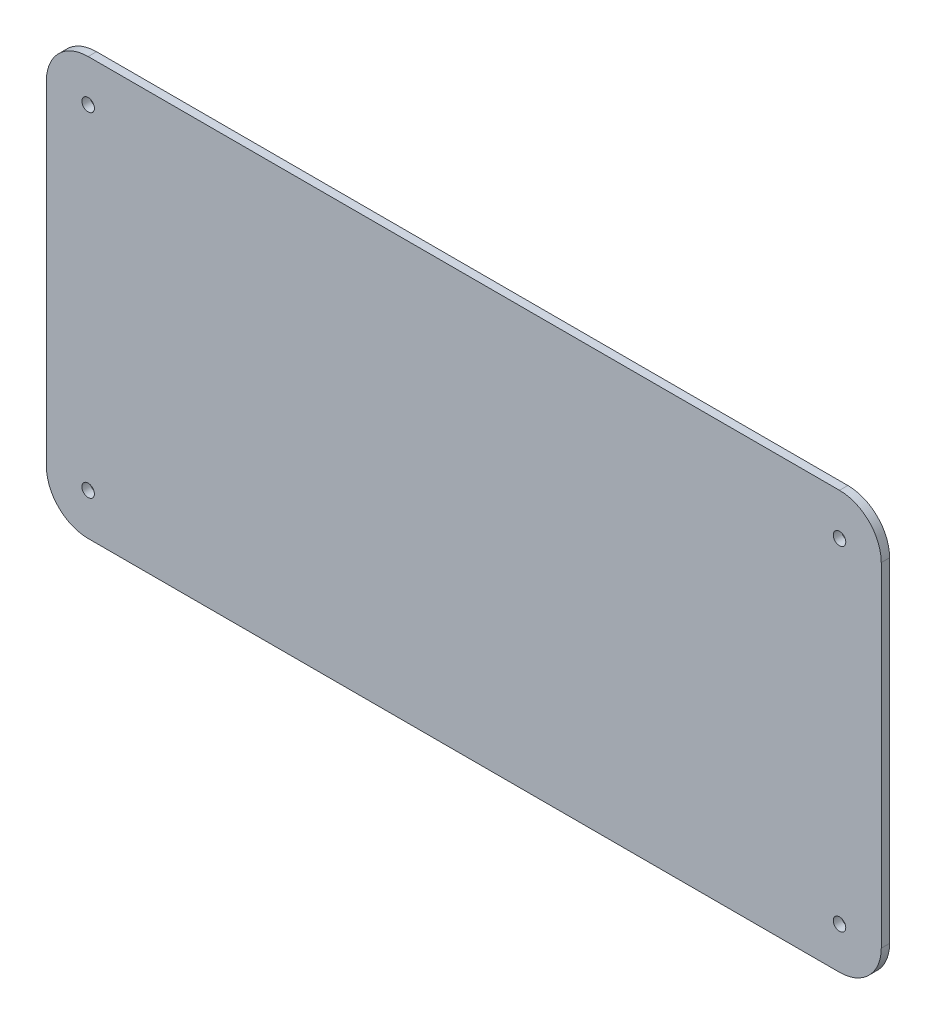
ISO-10303-21;
HEADER;
FILE_DESCRIPTION(('STEP AP214'),'2;1');
FILE_NAME('part.step','',(''),(''),'','','');
FILE_SCHEMA(('AUTOMOTIVE_DESIGN { 1 0 10303 214 1 1 1 1 }'));
ENDSEC;
DATA;
#1=APPLICATION_CONTEXT('core data for automotive mechanical design processes');
#2=APPLICATION_PROTOCOL_DEFINITION('international standard','automotive_design',2000,#1);
#3=PRODUCT_CONTEXT('',#1,'mechanical');
#4=PRODUCT('Part','Part','',(#3));
#5=PRODUCT_RELATED_PRODUCT_CATEGORY('part','',(#4));
#6=PRODUCT_DEFINITION_FORMATION('','',#4);
#7=PRODUCT_DEFINITION_CONTEXT('part definition',#1,'design');
#8=PRODUCT_DEFINITION('design','',#6,#7);
#9=PRODUCT_DEFINITION_SHAPE('','',#8);
#10=(LENGTH_UNIT() NAMED_UNIT(*) SI_UNIT(.MILLI.,.METRE.));
#11=(NAMED_UNIT(*) PLANE_ANGLE_UNIT() SI_UNIT($,.RADIAN.));
#12=(NAMED_UNIT(*) SI_UNIT($,.STERADIAN.) SOLID_ANGLE_UNIT());
#13=UNCERTAINTY_MEASURE_WITH_UNIT(LENGTH_MEASURE(1.E-05),#10,'distance_accuracy_value','');
#14=(GEOMETRIC_REPRESENTATION_CONTEXT(3) GLOBAL_UNCERTAINTY_ASSIGNED_CONTEXT((#13)) GLOBAL_UNIT_ASSIGNED_CONTEXT((#10,
#11,#12)) REPRESENTATION_CONTEXT('',''));
#15=CARTESIAN_POINT('',(0.,0.,0.));
#16=DIRECTION('',(0.,0.,1.));
#17=DIRECTION('',(1.,0.,0.));
#18=AXIS2_PLACEMENT_3D('',#15,#16,#17);
#19=CARTESIAN_POINT('',(81.474525227597,55.7590932445884,2.));
#20=DIRECTION('',(0.,0.,-1.));
#21=DIRECTION('',(-1.,0.,0.));
#22=AXIS2_PLACEMENT_3D('',#19,#20,#21);
#23=PLANE('',#22);
#24=CARTESIAN_POINT('',(81.474525227597,55.7590932445884,2.));
#25=DIRECTION('',(0.,0.,-1.));
#26=DIRECTION('',(-1.,0.,0.));
#27=AXIS2_PLACEMENT_3D('',#24,#25,#26);
#28=CIRCLE('',#27,9.99999999999999);
#29=CARTESIAN_POINT('',(81.474525227597,65.7590932445884,2.));
#30=VERTEX_POINT('',#29);
#31=CARTESIAN_POINT('',(91.474525227597,55.7590932445884,2.));
#32=VERTEX_POINT('',#31);
#33=EDGE_CURVE('E313',#30,#32,#28,.T.);
#34=ORIENTED_EDGE('',*,*,#33,.F.);
#35=DIRECTION('',(1.,0.,0.));
#36=VECTOR('',#35,1.);
#37=CARTESIAN_POINT('',(-98.5207026804079,65.7590932445884,2.));
#38=LINE('',#37,#36);
#39=CARTESIAN_POINT('',(-98.5207026804079,65.7590932445884,2.));
#40=VERTEX_POINT('',#39);
#41=EDGE_CURVE('E277',#40,#30,#38,.T.);
#42=ORIENTED_EDGE('',*,*,#41,.F.);
#43=CARTESIAN_POINT('',(-98.5207026804079,55.7590932445884,2.));
#44=DIRECTION('',(0.,0.,1.));
#45=DIRECTION('',(1.,0.,0.));
#46=AXIS2_PLACEMENT_3D('',#43,#44,#45);
#47=CIRCLE('',#46,9.99999999999999);
#48=CARTESIAN_POINT('',(-108.520702680408,55.7590932445884,2.));
#49=VERTEX_POINT('',#48);
#50=EDGE_CURVE('E272',#40,#49,#47,.T.);
#51=ORIENTED_EDGE('',*,*,#50,.T.);
#52=DIRECTION('',(0.,-1.,0.));
#53=VECTOR('',#52,1.);
#54=CARTESIAN_POINT('',(-108.520702680408,4.50909324458835,2.));
#55=LINE('',#54,#53);
#56=CARTESIAN_POINT('',(-108.520702680408,-24.2409067554117,2.));
#57=VERTEX_POINT('',#56);
#58=EDGE_CURVE('E262',#49,#57,#55,.T.);
#59=ORIENTED_EDGE('',*,*,#58,.T.);
#60=CARTESIAN_POINT('',(-98.5207026804079,-24.2409067554117,2.));
#61=DIRECTION('',(0.,0.,1.));
#62=DIRECTION('',(1.,0.,0.));
#63=AXIS2_PLACEMENT_3D('',#60,#61,#62);
#64=CIRCLE('',#63,10.);
#65=CARTESIAN_POINT('',(-98.5207026804079,-34.2409067554117,2.));
#66=VERTEX_POINT('',#65);
#67=EDGE_CURVE('E273',#57,#66,#64,.T.);
#68=ORIENTED_EDGE('',*,*,#67,.T.);
#69=DIRECTION('',(1.,0.,0.));
#70=VECTOR('',#69,1.);
#71=CARTESIAN_POINT('',(-98.5207026804079,-34.2409067554117,2.));
#72=LINE('',#71,#70);
#73=CARTESIAN_POINT('',(81.474525227597,-34.2409067554117,2.));
#74=VERTEX_POINT('',#73);
#75=EDGE_CURVE('E325',#66,#74,#72,.T.);
#76=ORIENTED_EDGE('',*,*,#75,.T.);
#77=CARTESIAN_POINT('',(81.474525227597,-24.2409067554117,2.));
#78=DIRECTION('',(0.,0.,1.));
#79=DIRECTION('',(1.,0.,0.));
#80=AXIS2_PLACEMENT_3D('',#77,#78,#79);
#81=CIRCLE('',#80,10.);
#82=CARTESIAN_POINT('',(91.474525227597,-24.2409067554117,2.));
#83=VERTEX_POINT('',#82);
#84=EDGE_CURVE('E317',#74,#83,#81,.T.);
#85=ORIENTED_EDGE('',*,*,#84,.T.);
#86=DIRECTION('',(0.,-1.,0.));
#87=VECTOR('',#86,1.);
#88=CARTESIAN_POINT('',(91.474525227597,55.7590932445884,2.));
#89=LINE('',#88,#87);
#90=EDGE_CURVE('E315',#32,#83,#89,.T.);
#91=ORIENTED_EDGE('',*,*,#90,.F.);
#92=EDGE_LOOP('',(#34,#42,#51,#59,#68,#76,#85,#91));
#93=FACE_BOUND('',#92,.T.);
#94=CARTESIAN_POINT('',(81.474525227597,55.7590932445884,2.));
#95=DIRECTION('',(0.,0.,1.));
#96=DIRECTION('',(1.,0.,0.));
#97=AXIS2_PLACEMENT_3D('',#94,#95,#96);
#98=CIRCLE('',#97,1.5);
#99=CARTESIAN_POINT('',(82.974525227597,55.7590932445884,2.));
#100=VERTEX_POINT('',#99);
#101=EDGE_CURVE('E299',#100,#100,#98,.T.);
#102=ORIENTED_EDGE('',*,*,#101,.F.);
#103=EDGE_LOOP('',(#102));
#104=FACE_BOUND('',#103,.T.);
#105=CARTESIAN_POINT('',(81.474525227597,-24.2409067554117,2.));
#106=DIRECTION('',(0.,0.,1.));
#107=DIRECTION('',(1.,0.,0.));
#108=AXIS2_PLACEMENT_3D('',#105,#106,#107);
#109=CIRCLE('',#108,1.5);
#110=CARTESIAN_POINT('',(82.974525227597,-24.2409067554117,2.));
#111=VERTEX_POINT('',#110);
#112=EDGE_CURVE('E441',#111,#111,#109,.T.);
#113=ORIENTED_EDGE('',*,*,#112,.F.);
#114=EDGE_LOOP('',(#113));
#115=FACE_BOUND('',#114,.T.);
#116=CARTESIAN_POINT('',(-98.5207026804079,-24.2409067554117,2.));
#117=DIRECTION('',(0.,0.,1.));
#118=DIRECTION('',(1.,0.,0.));
#119=AXIS2_PLACEMENT_3D('',#116,#117,#118);
#120=CIRCLE('',#119,1.5);
#121=CARTESIAN_POINT('',(-97.0207026804079,-24.2409067554117,2.));
#122=VERTEX_POINT('',#121);
#123=EDGE_CURVE('E435',#122,#122,#120,.T.);
#124=ORIENTED_EDGE('',*,*,#123,.F.);
#125=EDGE_LOOP('',(#124));
#126=FACE_BOUND('',#125,.T.);
#127=CARTESIAN_POINT('',(-98.5207026804079,55.7590932445884,2.));
#128=DIRECTION('',(0.,0.,1.));
#129=DIRECTION('',(1.,0.,0.));
#130=AXIS2_PLACEMENT_3D('',#127,#128,#129);
#131=CIRCLE('',#130,1.5);
#132=CARTESIAN_POINT('',(-97.0207026804079,55.7590932445884,2.));
#133=VERTEX_POINT('',#132);
#134=EDGE_CURVE('E426',#133,#133,#131,.T.);
#135=ORIENTED_EDGE('',*,*,#134,.F.);
#136=EDGE_LOOP('',(#135));
#137=FACE_BOUND('',#136,.T.);
#138=ADVANCED_FACE('F191',(#93,#104,#115,#126,#137),#23,.F.);
#139=CARTESIAN_POINT('',(81.474525227597,55.7590932445884,0.));
#140=DIRECTION('',(0.,0.,-1.));
#141=DIRECTION('',(-1.,0.,0.));
#142=AXIS2_PLACEMENT_3D('',#139,#140,#141);
#143=PLANE('',#142);
#144=CARTESIAN_POINT('',(-98.5207026804079,-24.2409067554117,0.));
#145=DIRECTION('',(0.,0.,1.));
#146=DIRECTION('',(1.,0.,0.));
#147=AXIS2_PLACEMENT_3D('',#144,#145,#146);
#148=CIRCLE('',#147,1.5);
#149=CARTESIAN_POINT('',(-97.0207026804079,-24.2409067554117,0.));
#150=VERTEX_POINT('',#149);
#151=EDGE_CURVE('E432',#150,#150,#148,.T.);
#152=ORIENTED_EDGE('',*,*,#151,.T.);
#153=EDGE_LOOP('',(#152));
#154=FACE_BOUND('',#153,.T.);
#155=CARTESIAN_POINT('',(81.474525227597,55.7590932445884,0.));
#156=DIRECTION('',(0.,0.,1.));
#157=DIRECTION('',(1.,0.,0.));
#158=AXIS2_PLACEMENT_3D('',#155,#156,#157);
#159=CIRCLE('',#158,1.5);
#160=CARTESIAN_POINT('',(82.974525227597,55.7590932445884,0.));
#161=VERTEX_POINT('',#160);
#162=EDGE_CURVE('E320',#161,#161,#159,.T.);
#163=ORIENTED_EDGE('',*,*,#162,.T.);
#164=EDGE_LOOP('',(#163));
#165=FACE_BOUND('',#164,.T.);
#166=CARTESIAN_POINT('',(81.474525227597,55.7590932445884,0.));
#167=DIRECTION('',(0.,0.,-1.));
#168=DIRECTION('',(-1.,0.,0.));
#169=AXIS2_PLACEMENT_3D('',#166,#167,#168);
#170=CIRCLE('',#169,9.99999999999999);
#171=CARTESIAN_POINT('',(81.474525227597,65.7590932445884,0.));
#172=VERTEX_POINT('',#171);
#173=CARTESIAN_POINT('',(91.474525227597,55.7590932445884,0.));
#174=VERTEX_POINT('',#173);
#175=EDGE_CURVE('E296',#172,#174,#170,.T.);
#176=ORIENTED_EDGE('',*,*,#175,.T.);
#177=DIRECTION('',(0.,-1.,0.));
#178=VECTOR('',#177,1.);
#179=CARTESIAN_POINT('',(91.474525227597,4.50909324458835,0.));
#180=LINE('',#179,#178);
#181=CARTESIAN_POINT('',(91.474525227597,-24.2409067554117,0.));
#182=VERTEX_POINT('',#181);
#183=EDGE_CURVE('E298',#174,#182,#180,.T.);
#184=ORIENTED_EDGE('',*,*,#183,.T.);
#185=CARTESIAN_POINT('',(81.474525227597,-24.2409067554117,0.));
#186=DIRECTION('',(0.,0.,1.));
#187=DIRECTION('',(1.,0.,0.));
#188=AXIS2_PLACEMENT_3D('',#185,#186,#187);
#189=CIRCLE('',#188,10.);
#190=CARTESIAN_POINT('',(81.474525227597,-34.2409067554117,0.));
#191=VERTEX_POINT('',#190);
#192=EDGE_CURVE('E302',#191,#182,#189,.T.);
#193=ORIENTED_EDGE('',*,*,#192,.F.);
#194=DIRECTION('',(1.,0.,0.));
#195=VECTOR('',#194,1.);
#196=CARTESIAN_POINT('',(-98.5207026804079,-34.2409067554117,0.));
#197=LINE('',#196,#195);
#198=CARTESIAN_POINT('',(-98.5207026804079,-34.2409067554117,0.));
#199=VERTEX_POINT('',#198);
#200=EDGE_CURVE('E304',#199,#191,#197,.T.);
#201=ORIENTED_EDGE('',*,*,#200,.F.);
#202=CARTESIAN_POINT('',(-98.5207026804079,-24.2409067554117,0.));
#203=DIRECTION('',(0.,0.,1.));
#204=DIRECTION('',(1.,0.,0.));
#205=AXIS2_PLACEMENT_3D('',#202,#203,#204);
#206=CIRCLE('',#205,10.);
#207=CARTESIAN_POINT('',(-108.520702680408,-24.2409067554117,0.));
#208=VERTEX_POINT('',#207);
#209=EDGE_CURVE('E306',#208,#199,#206,.T.);
#210=ORIENTED_EDGE('',*,*,#209,.F.);
#211=DIRECTION('',(0.,-1.,0.));
#212=VECTOR('',#211,1.);
#213=CARTESIAN_POINT('',(-108.520702680408,55.7590932445884,0.));
#214=LINE('',#213,#212);
#215=CARTESIAN_POINT('',(-108.520702680408,55.7590932445884,0.));
#216=VERTEX_POINT('',#215);
#217=EDGE_CURVE('E308',#216,#208,#214,.T.);
#218=ORIENTED_EDGE('',*,*,#217,.F.);
#219=CARTESIAN_POINT('',(-98.5207026804079,55.7590932445884,0.));
#220=DIRECTION('',(0.,0.,1.));
#221=DIRECTION('',(1.,0.,0.));
#222=AXIS2_PLACEMENT_3D('',#219,#220,#221);
#223=CIRCLE('',#222,9.99999999999999);
#224=CARTESIAN_POINT('',(-98.5207026804079,65.7590932445884,0.));
#225=VERTEX_POINT('',#224);
#226=EDGE_CURVE('E280',#225,#216,#223,.T.);
#227=ORIENTED_EDGE('',*,*,#226,.F.);
#228=DIRECTION('',(1.,0.,0.));
#229=VECTOR('',#228,1.);
#230=CARTESIAN_POINT('',(-98.5207026804079,65.7590932445884,0.));
#231=LINE('',#230,#229);
#232=EDGE_CURVE('E311',#225,#172,#231,.T.);
#233=ORIENTED_EDGE('',*,*,#232,.T.);
#234=EDGE_LOOP('',(#176,#184,#193,#201,#210,#218,#227,#233));
#235=FACE_BOUND('',#234,.T.);
#236=CARTESIAN_POINT('',(81.474525227597,-24.2409067554117,0.));
#237=DIRECTION('',(0.,0.,1.));
#238=DIRECTION('',(1.,0.,0.));
#239=AXIS2_PLACEMENT_3D('',#236,#237,#238);
#240=CIRCLE('',#239,1.5);
#241=CARTESIAN_POINT('',(82.974525227597,-24.2409067554117,0.));
#242=VERTEX_POINT('',#241);
#243=EDGE_CURVE('E438',#242,#242,#240,.T.);
#244=ORIENTED_EDGE('',*,*,#243,.T.);
#245=EDGE_LOOP('',(#244));
#246=FACE_BOUND('',#245,.T.);
#247=CARTESIAN_POINT('',(-98.5207026804079,55.7590932445884,0.));
#248=DIRECTION('',(0.,0.,1.));
#249=DIRECTION('',(1.,0.,0.));
#250=AXIS2_PLACEMENT_3D('',#247,#248,#249);
#251=CIRCLE('',#250,1.5);
#252=CARTESIAN_POINT('',(-97.0207026804079,55.7590932445884,0.));
#253=VERTEX_POINT('',#252);
#254=EDGE_CURVE('E429',#253,#253,#251,.T.);
#255=ORIENTED_EDGE('',*,*,#254,.T.);
#256=EDGE_LOOP('',(#255));
#257=FACE_BOUND('',#256,.T.);
#258=ADVANCED_FACE('F352',(#154,#165,#235,#246,#257),#143,.T.);
#259=CARTESIAN_POINT('',(81.474525227597,55.7590932445884,2.));
#260=DIRECTION('',(0.,0.,-1.));
#261=DIRECTION('',(-1.,0.,0.));
#262=AXIS2_PLACEMENT_3D('',#259,#260,#261);
#263=CYLINDRICAL_SURFACE('',#262,9.99999999999999);
#264=ORIENTED_EDGE('',*,*,#175,.F.);
#265=DIRECTION('',(0.,0.,-1.));
#266=VECTOR('',#265,1.);
#267=CARTESIAN_POINT('',(81.474525227597,65.7590932445884,2.));
#268=LINE('',#267,#266);
#269=EDGE_CURVE('E12',#30,#172,#268,.T.);
#270=ORIENTED_EDGE('',*,*,#269,.F.);
#271=ORIENTED_EDGE('',*,*,#33,.T.);
#272=DIRECTION('',(0.,0.,-1.));
#273=VECTOR('',#272,1.);
#274=CARTESIAN_POINT('',(91.474525227597,55.7590932445884,2.));
#275=LINE('',#274,#273);
#276=EDGE_CURVE('E195',#32,#174,#275,.T.);
#277=ORIENTED_EDGE('',*,*,#276,.T.);
#278=EDGE_LOOP('',(#264,#270,#271,#277));
#279=FACE_BOUND('',#278,.T.);
#280=ADVANCED_FACE('F193',(#279),#263,.T.);
#281=CARTESIAN_POINT('',(-98.5207026804079,65.7590932445884,2.));
#282=DIRECTION('',(0.,1.,0.));
#283=DIRECTION('',(0.,0.,1.));
#284=AXIS2_PLACEMENT_3D('',#281,#282,#283);
#285=PLANE('',#284);
#286=ORIENTED_EDGE('',*,*,#232,.F.);
#287=DIRECTION('',(0.,0.,-1.));
#288=VECTOR('',#287,1.);
#289=CARTESIAN_POINT('',(-98.5207026804079,65.7590932445884,2.));
#290=LINE('',#289,#288);
#291=EDGE_CURVE('E201',#40,#225,#290,.T.);
#292=ORIENTED_EDGE('',*,*,#291,.F.);
#293=ORIENTED_EDGE('',*,*,#41,.T.);
#294=ORIENTED_EDGE('',*,*,#269,.T.);
#295=EDGE_LOOP('',(#286,#292,#293,#294));
#296=FACE_BOUND('',#295,.T.);
#297=ADVANCED_FACE('F361',(#296),#285,.T.);
#298=CARTESIAN_POINT('',(-98.5207026804079,55.7590932445884,2.));
#299=DIRECTION('',(0.,0.,-1.));
#300=DIRECTION('',(-1.,0.,0.));
#301=AXIS2_PLACEMENT_3D('',#298,#299,#300);
#302=CYLINDRICAL_SURFACE('',#301,9.99999999999999);
#303=ORIENTED_EDGE('',*,*,#226,.T.);
#304=DIRECTION('',(0.,0.,-1.));
#305=VECTOR('',#304,1.);
#306=CARTESIAN_POINT('',(-108.520702680408,55.7590932445884,2.));
#307=LINE('',#306,#305);
#308=EDGE_CURVE('E266',#49,#216,#307,.T.);
#309=ORIENTED_EDGE('',*,*,#308,.F.);
#310=ORIENTED_EDGE('',*,*,#50,.F.);
#311=ORIENTED_EDGE('',*,*,#291,.T.);
#312=EDGE_LOOP('',(#303,#309,#310,#311));
#313=FACE_BOUND('',#312,.T.);
#314=ADVANCED_FACE('F279',(#313),#302,.T.);
#315=CARTESIAN_POINT('',(-108.520702680408,55.7590932445884,2.));
#316=DIRECTION('',(1.,0.,0.));
#317=DIRECTION('',(0.,0.,-1.));
#318=AXIS2_PLACEMENT_3D('',#315,#316,#317);
#319=PLANE('',#318);
#320=ORIENTED_EDGE('',*,*,#217,.T.);
#321=DIRECTION('',(0.,0.,-1.));
#322=VECTOR('',#321,1.);
#323=CARTESIAN_POINT('',(-108.520702680408,-24.2409067554117,2.));
#324=LINE('',#323,#322);
#325=EDGE_CURVE('E269',#57,#208,#324,.T.);
#326=ORIENTED_EDGE('',*,*,#325,.F.);
#327=ORIENTED_EDGE('',*,*,#58,.F.);
#328=ORIENTED_EDGE('',*,*,#308,.T.);
#329=EDGE_LOOP('',(#320,#326,#327,#328));
#330=FACE_BOUND('',#329,.T.);
#331=ADVANCED_FACE('F264',(#330),#319,.F.);
#332=CARTESIAN_POINT('',(-98.5207026804079,-24.2409067554117,2.));
#333=DIRECTION('',(0.,0.,-1.));
#334=DIRECTION('',(-1.,0.,0.));
#335=AXIS2_PLACEMENT_3D('',#332,#333,#334);
#336=CYLINDRICAL_SURFACE('',#335,10.);
#337=ORIENTED_EDGE('',*,*,#209,.T.);
#338=DIRECTION('',(0.,0.,-1.));
#339=VECTOR('',#338,1.);
#340=CARTESIAN_POINT('',(-98.5207026804079,-34.2409067554117,2.));
#341=LINE('',#340,#339);
#342=EDGE_CURVE('E283',#66,#199,#341,.T.);
#343=ORIENTED_EDGE('',*,*,#342,.F.);
#344=ORIENTED_EDGE('',*,*,#67,.F.);
#345=ORIENTED_EDGE('',*,*,#325,.T.);
#346=EDGE_LOOP('',(#337,#343,#344,#345));
#347=FACE_BOUND('',#346,.T.);
#348=ADVANCED_FACE('F331',(#347),#336,.T.);
#349=CARTESIAN_POINT('',(-98.5207026804079,-34.2409067554117,2.));
#350=DIRECTION('',(0.,1.,0.));
#351=DIRECTION('',(0.,0.,1.));
#352=AXIS2_PLACEMENT_3D('',#349,#350,#351);
#353=PLANE('',#352);
#354=ORIENTED_EDGE('',*,*,#200,.T.);
#355=DIRECTION('',(0.,0.,-1.));
#356=VECTOR('',#355,1.);
#357=CARTESIAN_POINT('',(81.474525227597,-34.2409067554117,2.));
#358=LINE('',#357,#356);
#359=EDGE_CURVE('E288',#74,#191,#358,.T.);
#360=ORIENTED_EDGE('',*,*,#359,.F.);
#361=ORIENTED_EDGE('',*,*,#75,.F.);
#362=ORIENTED_EDGE('',*,*,#342,.T.);
#363=EDGE_LOOP('',(#354,#360,#361,#362));
#364=FACE_BOUND('',#363,.T.);
#365=ADVANCED_FACE('F335',(#364),#353,.F.);
#366=CARTESIAN_POINT('',(81.474525227597,-24.2409067554117,2.));
#367=DIRECTION('',(0.,0.,-1.));
#368=DIRECTION('',(-1.,0.,0.));
#369=AXIS2_PLACEMENT_3D('',#366,#367,#368);
#370=CYLINDRICAL_SURFACE('',#369,10.);
#371=ORIENTED_EDGE('',*,*,#192,.T.);
#372=DIRECTION('',(0.,0.,-1.));
#373=VECTOR('',#372,1.);
#374=CARTESIAN_POINT('',(91.474525227597,-24.2409067554117,2.));
#375=LINE('',#374,#373);
#376=EDGE_CURVE('E290',#83,#182,#375,.T.);
#377=ORIENTED_EDGE('',*,*,#376,.F.);
#378=ORIENTED_EDGE('',*,*,#84,.F.);
#379=ORIENTED_EDGE('',*,*,#359,.T.);
#380=EDGE_LOOP('',(#371,#377,#378,#379));
#381=FACE_BOUND('',#380,.T.);
#382=ADVANCED_FACE('F339',(#381),#370,.T.);
#383=CARTESIAN_POINT('',(91.474525227597,4.50909324458835,2.));
#384=DIRECTION('',(1.,0.,0.));
#385=DIRECTION('',(0.,0.,-1.));
#386=AXIS2_PLACEMENT_3D('',#383,#384,#385);
#387=PLANE('',#386);
#388=ORIENTED_EDGE('',*,*,#183,.F.);
#389=ORIENTED_EDGE('',*,*,#276,.F.);
#390=ORIENTED_EDGE('',*,*,#90,.T.);
#391=ORIENTED_EDGE('',*,*,#376,.T.);
#392=EDGE_LOOP('',(#388,#389,#390,#391));
#393=FACE_BOUND('',#392,.T.);
#394=ADVANCED_FACE('F340',(#393),#387,.T.);
#395=CARTESIAN_POINT('',(81.474525227597,55.7590932445884,2.));
#396=DIRECTION('',(0.,0.,-1.));
#397=DIRECTION('',(-1.,0.,0.));
#398=AXIS2_PLACEMENT_3D('',#395,#396,#397);
#399=CYLINDRICAL_SURFACE('',#398,1.5);
#400=ORIENTED_EDGE('',*,*,#101,.T.);
#401=EDGE_LOOP('',(#400));
#402=FACE_BOUND('',#401,.T.);
#403=ORIENTED_EDGE('',*,*,#162,.F.);
#404=EDGE_LOOP('',(#403));
#405=FACE_BOUND('',#404,.T.);
#406=ADVANCED_FACE('F342',(#402,#405),#399,.F.);
#407=CARTESIAN_POINT('',(81.474525227597,-24.2409067554117,2.));
#408=DIRECTION('',(0.,0.,-1.));
#409=DIRECTION('',(-1.,0.,0.));
#410=AXIS2_PLACEMENT_3D('',#407,#408,#409);
#411=CYLINDRICAL_SURFACE('',#410,1.5);
#412=ORIENTED_EDGE('',*,*,#112,.T.);
#413=EDGE_LOOP('',(#412));
#414=FACE_BOUND('',#413,.T.);
#415=ORIENTED_EDGE('',*,*,#243,.F.);
#416=EDGE_LOOP('',(#415));
#417=FACE_BOUND('',#416,.T.);
#418=ADVANCED_FACE('F347',(#414,#417),#411,.F.);
#419=CARTESIAN_POINT('',(-98.5207026804079,-24.2409067554117,2.));
#420=DIRECTION('',(0.,0.,-1.));
#421=DIRECTION('',(-1.,0.,0.));
#422=AXIS2_PLACEMENT_3D('',#419,#420,#421);
#423=CYLINDRICAL_SURFACE('',#422,1.5);
#424=ORIENTED_EDGE('',*,*,#123,.T.);
#425=EDGE_LOOP('',(#424));
#426=FACE_BOUND('',#425,.T.);
#427=ORIENTED_EDGE('',*,*,#151,.F.);
#428=EDGE_LOOP('',(#427));
#429=FACE_BOUND('',#428,.T.);
#430=ADVANCED_FACE('F400',(#426,#429),#423,.F.);
#431=CARTESIAN_POINT('',(-98.5207026804079,55.7590932445884,2.));
#432=DIRECTION('',(0.,0.,-1.));
#433=DIRECTION('',(-1.,0.,0.));
#434=AXIS2_PLACEMENT_3D('',#431,#432,#433);
#435=CYLINDRICAL_SURFACE('',#434,1.5);
#436=ORIENTED_EDGE('',*,*,#134,.T.);
#437=EDGE_LOOP('',(#436));
#438=FACE_BOUND('',#437,.T.);
#439=ORIENTED_EDGE('',*,*,#254,.F.);
#440=EDGE_LOOP('',(#439));
#441=FACE_BOUND('',#440,.T.);
#442=ADVANCED_FACE('F409',(#438,#441),#435,.F.);
#443=CLOSED_SHELL('',(#138,#258,#280,#297,#314,#331,#348,#365,#382,#394,#406,#418,#430,#442));
#444=MANIFOLD_SOLID_BREP('B2',#443);
#445=ADVANCED_BREP_SHAPE_REPRESENTATION('',(#18,#444),#14);
#446=SHAPE_DEFINITION_REPRESENTATION(#9,#445);
ENDSEC;
END-ISO-10303-21;
